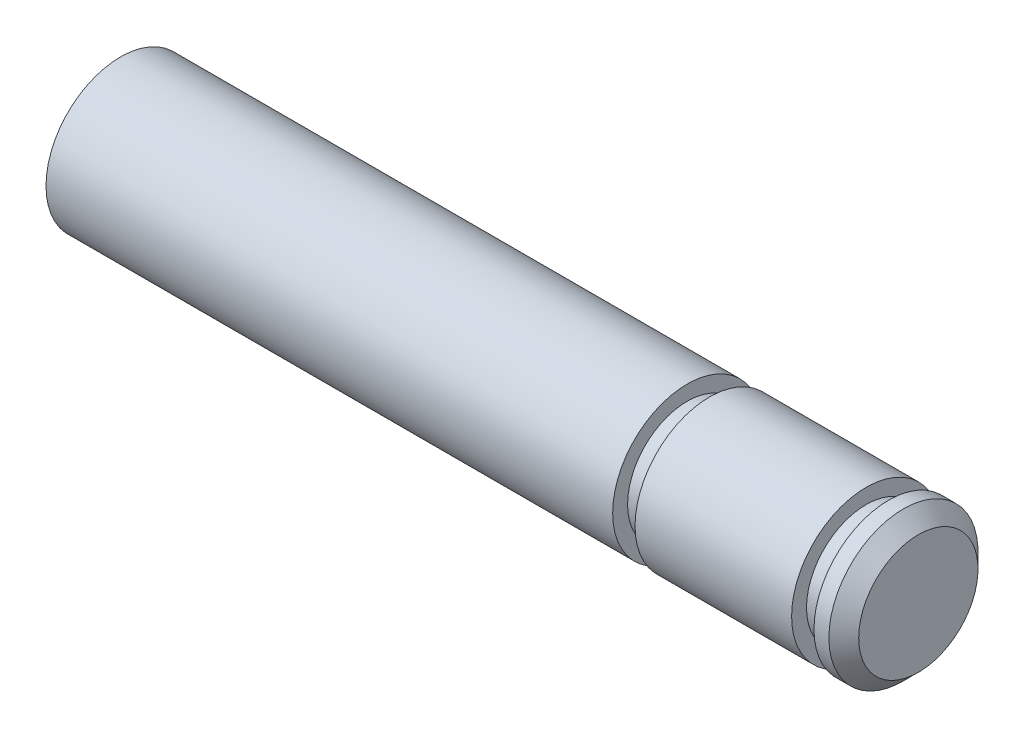
ISO-10303-21;
HEADER;
FILE_DESCRIPTION(('STEP AP214'),'2;1');
FILE_NAME('part.step','',(''),(''),'','','');
FILE_SCHEMA(('AUTOMOTIVE_DESIGN { 1 0 10303 214 1 1 1 1 }'));
ENDSEC;
DATA;
#1=APPLICATION_CONTEXT('core data for automotive mechanical design processes');
#2=APPLICATION_PROTOCOL_DEFINITION('international standard','automotive_design',2000,#1);
#3=PRODUCT_CONTEXT('',#1,'mechanical');
#4=PRODUCT('Part','Part','',(#3));
#5=PRODUCT_RELATED_PRODUCT_CATEGORY('part','',(#4));
#6=PRODUCT_DEFINITION_FORMATION('','',#4);
#7=PRODUCT_DEFINITION_CONTEXT('part definition',#1,'design');
#8=PRODUCT_DEFINITION('design','',#6,#7);
#9=PRODUCT_DEFINITION_SHAPE('','',#8);
#10=(LENGTH_UNIT() NAMED_UNIT(*) SI_UNIT(.MILLI.,.METRE.));
#11=(NAMED_UNIT(*) PLANE_ANGLE_UNIT() SI_UNIT($,.RADIAN.));
#12=(NAMED_UNIT(*) SI_UNIT($,.STERADIAN.) SOLID_ANGLE_UNIT());
#13=UNCERTAINTY_MEASURE_WITH_UNIT(LENGTH_MEASURE(1.E-05),#10,'distance_accuracy_value','');
#14=(GEOMETRIC_REPRESENTATION_CONTEXT(3) GLOBAL_UNCERTAINTY_ASSIGNED_CONTEXT((#13)) GLOBAL_UNIT_ASSIGNED_CONTEXT((#10,
#11,#12)) REPRESENTATION_CONTEXT('',''));
#15=CARTESIAN_POINT('',(0.,0.,0.));
#16=DIRECTION('',(0.,0.,1.));
#17=DIRECTION('',(1.,0.,0.));
#18=AXIS2_PLACEMENT_3D('',#15,#16,#17);
#19=CARTESIAN_POINT('',(0.,0.,0.));
#20=DIRECTION('',(1.,0.,0.));
#21=DIRECTION('',(0.,0.,-1.));
#22=AXIS2_PLACEMENT_3D('',#19,#20,#21);
#23=PLANE('',#22);
#24=CARTESIAN_POINT('',(0.,0.,0.));
#25=DIRECTION('',(-1.,0.,0.));
#26=DIRECTION('',(0.,0.,1.));
#27=AXIS2_PLACEMENT_3D('',#24,#25,#26);
#28=CIRCLE('',#27,5.);
#29=CARTESIAN_POINT('',(0.,0.,5.));
#30=VERTEX_POINT('',#29);
#31=EDGE_CURVE('E48',#30,#30,#28,.T.);
#32=ORIENTED_EDGE('',*,*,#31,.T.);
#33=EDGE_LOOP('',(#32));
#34=FACE_BOUND('',#33,.T.);
#35=ADVANCED_FACE('F37',(#34),#23,.F.);
#36=CARTESIAN_POINT('',(-16.6780785202122,0.,0.));
#37=DIRECTION('',(-1.,0.,0.));
#38=DIRECTION('',(0.,0.,1.));
#39=AXIS2_PLACEMENT_3D('',#36,#37,#38);
#40=CYLINDRICAL_SURFACE('',#39,5.);
#41=ORIENTED_EDGE('',*,*,#31,.F.);
#42=EDGE_LOOP('',(#41));
#43=FACE_BOUND('',#42,.T.);
#44=CARTESIAN_POINT('',(38.,0.,0.));
#45=DIRECTION('',(-1.,0.,0.));
#46=DIRECTION('',(0.,0.,1.));
#47=AXIS2_PLACEMENT_3D('',#44,#45,#46);
#48=CIRCLE('',#47,5.);
#49=CARTESIAN_POINT('',(38.,0.,5.));
#50=VERTEX_POINT('',#49);
#51=EDGE_CURVE('E52',#50,#50,#48,.T.);
#52=ORIENTED_EDGE('',*,*,#51,.T.);
#53=EDGE_LOOP('',(#52));
#54=FACE_BOUND('',#53,.T.);
#55=ADVANCED_FACE('F95',(#43,#54),#40,.T.);
#56=CARTESIAN_POINT('',(38.,5.,0.));
#57=DIRECTION('',(-1.,0.,0.));
#58=DIRECTION('',(0.,0.,1.));
#59=AXIS2_PLACEMENT_3D('',#56,#57,#58);
#60=PLANE('',#59);
#61=ORIENTED_EDGE('',*,*,#51,.F.);
#62=EDGE_LOOP('',(#61));
#63=FACE_BOUND('',#62,.T.);
#64=CARTESIAN_POINT('',(38.,0.,0.));
#65=DIRECTION('',(-1.,0.,0.));
#66=DIRECTION('',(0.,0.,1.));
#67=AXIS2_PLACEMENT_3D('',#64,#65,#66);
#68=CIRCLE('',#67,4.);
#69=CARTESIAN_POINT('',(38.,0.,4.));
#70=VERTEX_POINT('',#69);
#71=EDGE_CURVE('E57',#70,#70,#68,.T.);
#72=ORIENTED_EDGE('',*,*,#71,.T.);
#73=EDGE_LOOP('',(#72));
#74=FACE_BOUND('',#73,.T.);
#75=ADVANCED_FACE('F100',(#63,#74),#60,.F.);
#76=CARTESIAN_POINT('',(-16.6780785202122,0.,0.));
#77=DIRECTION('',(-1.,0.,0.));
#78=DIRECTION('',(0.,0.,1.));
#79=AXIS2_PLACEMENT_3D('',#76,#77,#78);
#80=CYLINDRICAL_SURFACE('',#79,4.);
#81=ORIENTED_EDGE('',*,*,#71,.F.);
#82=EDGE_LOOP('',(#81));
#83=FACE_BOUND('',#82,.T.);
#84=CARTESIAN_POINT('',(39.5,0.,0.));
#85=DIRECTION('',(-1.,0.,0.));
#86=DIRECTION('',(0.,0.,1.));
#87=AXIS2_PLACEMENT_3D('',#84,#85,#86);
#88=CIRCLE('',#87,4.);
#89=CARTESIAN_POINT('',(39.5,0.,4.));
#90=VERTEX_POINT('',#89);
#91=EDGE_CURVE('E60',#90,#90,#88,.T.);
#92=ORIENTED_EDGE('',*,*,#91,.T.);
#93=EDGE_LOOP('',(#92));
#94=FACE_BOUND('',#93,.T.);
#95=ADVANCED_FACE('F106',(#83,#94),#80,.T.);
#96=CARTESIAN_POINT('',(39.5,4.,0.));
#97=DIRECTION('',(1.,0.,0.));
#98=DIRECTION('',(0.,0.,-1.));
#99=AXIS2_PLACEMENT_3D('',#96,#97,#98);
#100=PLANE('',#99);
#101=ORIENTED_EDGE('',*,*,#91,.F.);
#102=EDGE_LOOP('',(#101));
#103=FACE_BOUND('',#102,.T.);
#104=CARTESIAN_POINT('',(39.5,0.,0.));
#105=DIRECTION('',(-1.,0.,0.));
#106=DIRECTION('',(0.,0.,1.));
#107=AXIS2_PLACEMENT_3D('',#104,#105,#106);
#108=CIRCLE('',#107,5.);
#109=CARTESIAN_POINT('',(39.5,0.,5.));
#110=VERTEX_POINT('',#109);
#111=EDGE_CURVE('E63',#110,#110,#108,.T.);
#112=ORIENTED_EDGE('',*,*,#111,.T.);
#113=EDGE_LOOP('',(#112));
#114=FACE_BOUND('',#113,.T.);
#115=ADVANCED_FACE('F110',(#103,#114),#100,.F.);
#116=CARTESIAN_POINT('',(-16.6780785202122,0.,0.));
#117=DIRECTION('',(-1.,0.,0.));
#118=DIRECTION('',(0.,0.,1.));
#119=AXIS2_PLACEMENT_3D('',#116,#117,#118);
#120=CYLINDRICAL_SURFACE('',#119,5.);
#121=ORIENTED_EDGE('',*,*,#111,.F.);
#122=EDGE_LOOP('',(#121));
#123=FACE_BOUND('',#122,.T.);
#124=CARTESIAN_POINT('',(50.,0.,0.));
#125=DIRECTION('',(-1.,0.,0.));
#126=DIRECTION('',(0.,0.,1.));
#127=AXIS2_PLACEMENT_3D('',#124,#125,#126);
#128=CIRCLE('',#127,5.);
#129=CARTESIAN_POINT('',(50.,0.,5.));
#130=VERTEX_POINT('',#129);
#131=EDGE_CURVE('E66',#130,#130,#128,.T.);
#132=ORIENTED_EDGE('',*,*,#131,.T.);
#133=EDGE_LOOP('',(#132));
#134=FACE_BOUND('',#133,.T.);
#135=ADVANCED_FACE('F114',(#123,#134),#120,.T.);
#136=CARTESIAN_POINT('',(50.,5.,0.));
#137=DIRECTION('',(-1.,0.,0.));
#138=DIRECTION('',(0.,0.,1.));
#139=AXIS2_PLACEMENT_3D('',#136,#137,#138);
#140=PLANE('',#139);
#141=ORIENTED_EDGE('',*,*,#131,.F.);
#142=EDGE_LOOP('',(#141));
#143=FACE_BOUND('',#142,.T.);
#144=CARTESIAN_POINT('',(50.,0.,0.));
#145=DIRECTION('',(-1.,0.,0.));
#146=DIRECTION('',(0.,0.,1.));
#147=AXIS2_PLACEMENT_3D('',#144,#145,#146);
#148=CIRCLE('',#147,4.);
#149=CARTESIAN_POINT('',(50.,0.,4.));
#150=VERTEX_POINT('',#149);
#151=EDGE_CURVE('E70',#150,#150,#148,.T.);
#152=ORIENTED_EDGE('',*,*,#151,.T.);
#153=EDGE_LOOP('',(#152));
#154=FACE_BOUND('',#153,.T.);
#155=ADVANCED_FACE('F118',(#143,#154),#140,.F.);
#156=CARTESIAN_POINT('',(-16.6780785202122,0.,0.));
#157=DIRECTION('',(-1.,0.,0.));
#158=DIRECTION('',(0.,0.,1.));
#159=AXIS2_PLACEMENT_3D('',#156,#157,#158);
#160=CYLINDRICAL_SURFACE('',#159,4.);
#161=ORIENTED_EDGE('',*,*,#151,.F.);
#162=EDGE_LOOP('',(#161));
#163=FACE_BOUND('',#162,.T.);
#164=CARTESIAN_POINT('',(51.5,0.,0.));
#165=DIRECTION('',(-1.,0.,0.));
#166=DIRECTION('',(0.,0.,1.));
#167=AXIS2_PLACEMENT_3D('',#164,#165,#166);
#168=CIRCLE('',#167,4.);
#169=CARTESIAN_POINT('',(51.5,0.,4.));
#170=VERTEX_POINT('',#169);
#171=EDGE_CURVE('E73',#170,#170,#168,.T.);
#172=ORIENTED_EDGE('',*,*,#171,.T.);
#173=EDGE_LOOP('',(#172));
#174=FACE_BOUND('',#173,.T.);
#175=ADVANCED_FACE('F91',(#163,#174),#160,.T.);
#176=CARTESIAN_POINT('',(51.5,4.,0.));
#177=DIRECTION('',(1.,0.,0.));
#178=DIRECTION('',(0.,0.,-1.));
#179=AXIS2_PLACEMENT_3D('',#176,#177,#178);
#180=PLANE('',#179);
#181=ORIENTED_EDGE('',*,*,#171,.F.);
#182=EDGE_LOOP('',(#181));
#183=FACE_BOUND('',#182,.T.);
#184=CARTESIAN_POINT('',(51.5,0.,0.));
#185=DIRECTION('',(-1.,0.,0.));
#186=DIRECTION('',(0.,0.,1.));
#187=AXIS2_PLACEMENT_3D('',#184,#185,#186);
#188=CIRCLE('',#187,5.);
#189=CARTESIAN_POINT('',(51.5,0.,5.));
#190=VERTEX_POINT('',#189);
#191=EDGE_CURVE('E76',#190,#190,#188,.T.);
#192=ORIENTED_EDGE('',*,*,#191,.T.);
#193=EDGE_LOOP('',(#192));
#194=FACE_BOUND('',#193,.T.);
#195=ADVANCED_FACE('F80',(#183,#194),#180,.F.);
#196=CARTESIAN_POINT('',(-16.6780785202122,0.,0.));
#197=DIRECTION('',(-1.,0.,0.));
#198=DIRECTION('',(0.,0.,1.));
#199=AXIS2_PLACEMENT_3D('',#196,#197,#198);
#200=CYLINDRICAL_SURFACE('',#199,5.);
#201=CARTESIAN_POINT('',(52.5,0.,0.));
#202=DIRECTION('',(-1.,0.,0.));
#203=DIRECTION('',(0.,0.,1.));
#204=AXIS2_PLACEMENT_3D('',#201,#202,#203);
#205=CIRCLE('',#204,5.);
#206=CARTESIAN_POINT('',(52.5,0.,5.));
#207=VERTEX_POINT('',#206);
#208=EDGE_CURVE('E44',#207,#207,#205,.T.);
#209=ORIENTED_EDGE('',*,*,#208,.T.);
#210=EDGE_LOOP('',(#209));
#211=FACE_BOUND('',#210,.T.);
#212=ORIENTED_EDGE('',*,*,#191,.F.);
#213=EDGE_LOOP('',(#212));
#214=FACE_BOUND('',#213,.T.);
#215=ADVANCED_FACE('F82',(#211,#214),#200,.T.);
#216=CARTESIAN_POINT('',(53.5,5.,0.));
#217=DIRECTION('',(-1.,0.,0.));
#218=DIRECTION('',(0.,0.,1.));
#219=AXIS2_PLACEMENT_3D('',#216,#217,#218);
#220=PLANE('',#219);
#221=CARTESIAN_POINT('',(53.5,0.,0.));
#222=DIRECTION('',(-1.,0.,0.));
#223=DIRECTION('',(0.,0.,1.));
#224=AXIS2_PLACEMENT_3D('',#221,#222,#223);
#225=CIRCLE('',#224,3.99999999999998);
#226=CARTESIAN_POINT('',(53.5,0.,3.99999999999998));
#227=VERTEX_POINT('',#226);
#228=EDGE_CURVE('E10',#227,#227,#225,.F.);
#229=ORIENTED_EDGE('',*,*,#228,.T.);
#230=EDGE_LOOP('',(#229));
#231=FACE_BOUND('',#230,.T.);
#232=ADVANCED_FACE('F84',(#231),#220,.F.);
#233=CARTESIAN_POINT('',(52.5,0.,0.));
#234=DIRECTION('',(-1.,0.,0.));
#235=DIRECTION('',(0.,0.,1.));
#236=AXIS2_PLACEMENT_3D('',#233,#234,#235);
#237=CONICAL_SURFACE('',#236,5.,0.78539816339745);
#238=ORIENTED_EDGE('',*,*,#228,.F.);
#239=EDGE_LOOP('',(#238));
#240=FACE_BOUND('',#239,.T.);
#241=ORIENTED_EDGE('',*,*,#208,.F.);
#242=EDGE_LOOP('',(#241));
#243=FACE_BOUND('',#242,.T.);
#244=ADVANCED_FACE('F39',(#240,#243),#237,.T.);
#245=CLOSED_SHELL('',(#35,#55,#75,#95,#115,#135,#155,#175,#195,#215,#232,#244));
#246=MANIFOLD_SOLID_BREP('B2',#245);
#247=ADVANCED_BREP_SHAPE_REPRESENTATION('',(#18,#246),#14);
#248=SHAPE_DEFINITION_REPRESENTATION(#9,#247);
ENDSEC;
END-ISO-10303-21;
